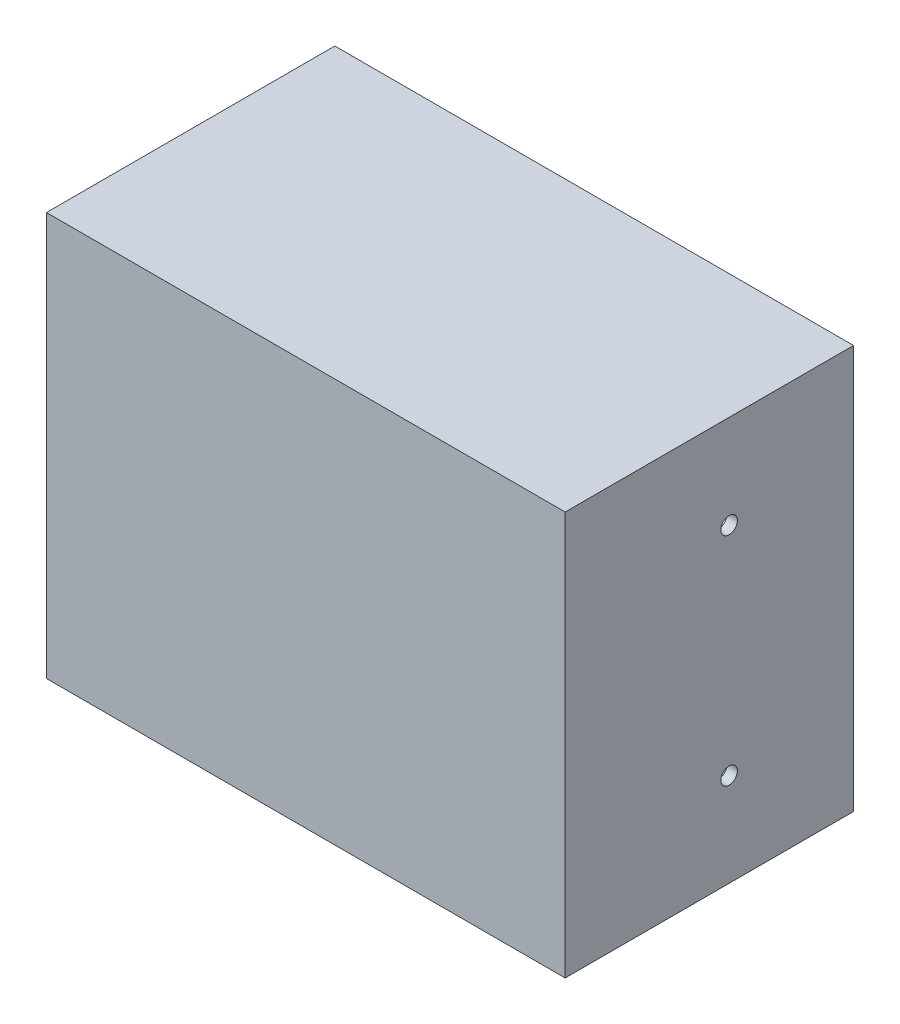
ISO-10303-21;
HEADER;
FILE_DESCRIPTION(('STEP AP214'),'2;1');
FILE_NAME('part.step','',(''),(''),'','','');
FILE_SCHEMA(('AUTOMOTIVE_DESIGN { 1 0 10303 214 1 1 1 1 }'));
ENDSEC;
DATA;
#1=APPLICATION_CONTEXT('core data for automotive mechanical design processes');
#2=APPLICATION_PROTOCOL_DEFINITION('international standard','automotive_design',2000,#1);
#3=PRODUCT_CONTEXT('',#1,'mechanical');
#4=PRODUCT('Part','Part','',(#3));
#5=PRODUCT_RELATED_PRODUCT_CATEGORY('part','',(#4));
#6=PRODUCT_DEFINITION_FORMATION('','',#4);
#7=PRODUCT_DEFINITION_CONTEXT('part definition',#1,'design');
#8=PRODUCT_DEFINITION('design','',#6,#7);
#9=PRODUCT_DEFINITION_SHAPE('','',#8);
#10=(LENGTH_UNIT() NAMED_UNIT(*) SI_UNIT(.MILLI.,.METRE.));
#11=(NAMED_UNIT(*) PLANE_ANGLE_UNIT() SI_UNIT($,.RADIAN.));
#12=(NAMED_UNIT(*) SI_UNIT($,.STERADIAN.) SOLID_ANGLE_UNIT());
#13=UNCERTAINTY_MEASURE_WITH_UNIT(LENGTH_MEASURE(1.E-05),#10,'distance_accuracy_value','');
#14=(GEOMETRIC_REPRESENTATION_CONTEXT(3) GLOBAL_UNCERTAINTY_ASSIGNED_CONTEXT((#13)) GLOBAL_UNIT_ASSIGNED_CONTEXT((#10,
#11,#12)) REPRESENTATION_CONTEXT('',''));
#15=CARTESIAN_POINT('',(0.,0.,0.));
#16=DIRECTION('',(0.,0.,1.));
#17=DIRECTION('',(1.,0.,0.));
#18=AXIS2_PLACEMENT_3D('',#15,#16,#17);
#19=CARTESIAN_POINT('',(-125.,-97.25,139.));
#20=DIRECTION('',(-1.,0.,0.));
#21=DIRECTION('',(0.,0.,1.));
#22=AXIS2_PLACEMENT_3D('',#19,#20,#21);
#23=PLANE('',#22);
#24=CARTESIAN_POINT('',(-125.,52.25,60.));
#25=DIRECTION('',(-1.,0.,0.));
#26=DIRECTION('',(0.,0.,1.));
#27=AXIS2_PLACEMENT_3D('',#24,#25,#26);
#28=CIRCLE('',#27,3.99999999999999);
#29=CARTESIAN_POINT('',(-125.,52.25,64.));
#30=VERTEX_POINT('',#29);
#31=EDGE_CURVE('E186',#30,#30,#28,.T.);
#32=ORIENTED_EDGE('',*,*,#31,.F.);
#33=EDGE_LOOP('',(#32));
#34=FACE_BOUND('',#33,.T.);
#35=CARTESIAN_POINT('',(-125.,-52.25,60.));
#36=DIRECTION('',(-1.,0.,0.));
#37=DIRECTION('',(0.,0.,1.));
#38=AXIS2_PLACEMENT_3D('',#35,#36,#37);
#39=CIRCLE('',#38,3.99999999999999);
#40=CARTESIAN_POINT('',(-125.,-52.25,64.));
#41=VERTEX_POINT('',#40);
#42=EDGE_CURVE('E174',#41,#41,#39,.T.);
#43=ORIENTED_EDGE('',*,*,#42,.F.);
#44=EDGE_LOOP('',(#43));
#45=FACE_BOUND('',#44,.T.);
#46=DIRECTION('',(0.,1.,0.));
#47=VECTOR('',#46,1.);
#48=CARTESIAN_POINT('',(-125.,-97.25,0.));
#49=LINE('',#48,#47);
#50=CARTESIAN_POINT('',(-125.,-97.25,0.));
#51=VERTEX_POINT('',#50);
#52=CARTESIAN_POINT('',(-125.,97.25,0.));
#53=VERTEX_POINT('',#52);
#54=EDGE_CURVE('E141',#51,#53,#49,.T.);
#55=ORIENTED_EDGE('',*,*,#54,.F.);
#56=DIRECTION('',(0.,0.,-1.));
#57=VECTOR('',#56,1.);
#58=CARTESIAN_POINT('',(-125.,-97.25,139.));
#59=LINE('',#58,#57);
#60=CARTESIAN_POINT('',(-125.,-97.25,139.));
#61=VERTEX_POINT('',#60);
#62=EDGE_CURVE('E11',#61,#51,#59,.T.);
#63=ORIENTED_EDGE('',*,*,#62,.F.);
#64=DIRECTION('',(0.,1.,0.));
#65=VECTOR('',#64,1.);
#66=CARTESIAN_POINT('',(-125.,-97.25,139.));
#67=LINE('',#66,#65);
#68=CARTESIAN_POINT('',(-125.,97.25,139.));
#69=VERTEX_POINT('',#68);
#70=EDGE_CURVE('E145',#61,#69,#67,.T.);
#71=ORIENTED_EDGE('',*,*,#70,.T.);
#72=DIRECTION('',(0.,0.,-1.));
#73=VECTOR('',#72,1.);
#74=CARTESIAN_POINT('',(-125.,97.25,139.));
#75=LINE('',#74,#73);
#76=EDGE_CURVE('E80',#69,#53,#75,.T.);
#77=ORIENTED_EDGE('',*,*,#76,.T.);
#78=EDGE_LOOP('',(#55,#63,#71,#77));
#79=FACE_BOUND('',#78,.T.);
#80=ADVANCED_FACE('F32',(#34,#45,#79),#23,.T.);
#81=CARTESIAN_POINT('',(-125.,-97.25,139.));
#82=DIRECTION('',(0.,1.,0.));
#83=DIRECTION('',(0.,0.,1.));
#84=AXIS2_PLACEMENT_3D('',#81,#82,#83);
#85=PLANE('',#84);
#86=DIRECTION('',(1.,0.,0.));
#87=VECTOR('',#86,1.);
#88=CARTESIAN_POINT('',(-125.,-97.25,0.));
#89=LINE('',#88,#87);
#90=CARTESIAN_POINT('',(125.,-97.25,0.));
#91=VERTEX_POINT('',#90);
#92=EDGE_CURVE('E148',#51,#91,#89,.T.);
#93=ORIENTED_EDGE('',*,*,#92,.T.);
#94=DIRECTION('',(0.,0.,-1.));
#95=VECTOR('',#94,1.);
#96=CARTESIAN_POINT('',(125.,-97.25,139.));
#97=LINE('',#96,#95);
#98=CARTESIAN_POINT('',(125.,-97.25,139.));
#99=VERTEX_POINT('',#98);
#100=EDGE_CURVE('E40',#99,#91,#97,.T.);
#101=ORIENTED_EDGE('',*,*,#100,.F.);
#102=DIRECTION('',(1.,0.,0.));
#103=VECTOR('',#102,1.);
#104=CARTESIAN_POINT('',(-125.,-97.25,139.));
#105=LINE('',#104,#103);
#106=EDGE_CURVE('E152',#61,#99,#105,.T.);
#107=ORIENTED_EDGE('',*,*,#106,.F.);
#108=ORIENTED_EDGE('',*,*,#62,.T.);
#109=EDGE_LOOP('',(#93,#101,#107,#108));
#110=FACE_BOUND('',#109,.T.);
#111=ADVANCED_FACE('F194',(#110),#85,.F.);
#112=CARTESIAN_POINT('',(125.,-97.25,139.));
#113=DIRECTION('',(-1.,0.,0.));
#114=DIRECTION('',(0.,0.,1.));
#115=AXIS2_PLACEMENT_3D('',#112,#113,#114);
#116=PLANE('',#115);
#117=CARTESIAN_POINT('',(125.,52.25,60.));
#118=DIRECTION('',(-1.,0.,0.));
#119=DIRECTION('',(0.,0.,1.));
#120=AXIS2_PLACEMENT_3D('',#117,#118,#119);
#121=CIRCLE('',#120,3.99999999999997);
#122=CARTESIAN_POINT('',(125.,52.25,64.));
#123=VERTEX_POINT('',#122);
#124=EDGE_CURVE('E183',#123,#123,#121,.T.);
#125=ORIENTED_EDGE('',*,*,#124,.T.);
#126=EDGE_LOOP('',(#125));
#127=FACE_BOUND('',#126,.T.);
#128=CARTESIAN_POINT('',(125.,-52.25,60.));
#129=DIRECTION('',(-1.,0.,0.));
#130=DIRECTION('',(0.,0.,1.));
#131=AXIS2_PLACEMENT_3D('',#128,#129,#130);
#132=CIRCLE('',#131,3.99999999999997);
#133=CARTESIAN_POINT('',(125.,-52.25,64.));
#134=VERTEX_POINT('',#133);
#135=EDGE_CURVE('E169',#134,#134,#132,.T.);
#136=ORIENTED_EDGE('',*,*,#135,.T.);
#137=EDGE_LOOP('',(#136));
#138=FACE_BOUND('',#137,.T.);
#139=DIRECTION('',(0.,1.,0.));
#140=VECTOR('',#139,1.);
#141=CARTESIAN_POINT('',(125.,-97.25,0.));
#142=LINE('',#141,#140);
#143=CARTESIAN_POINT('',(125.,97.25,0.));
#144=VERTEX_POINT('',#143);
#145=EDGE_CURVE('E159',#91,#144,#142,.T.);
#146=ORIENTED_EDGE('',*,*,#145,.T.);
#147=DIRECTION('',(0.,0.,-1.));
#148=VECTOR('',#147,1.);
#149=CARTESIAN_POINT('',(125.,97.25,139.));
#150=LINE('',#149,#148);
#151=CARTESIAN_POINT('',(125.,97.25,139.));
#152=VERTEX_POINT('',#151);
#153=EDGE_CURVE('E165',#152,#144,#150,.T.);
#154=ORIENTED_EDGE('',*,*,#153,.F.);
#155=DIRECTION('',(0.,1.,0.));
#156=VECTOR('',#155,1.);
#157=CARTESIAN_POINT('',(125.,-97.25,139.));
#158=LINE('',#157,#156);
#159=EDGE_CURVE('E150',#99,#152,#158,.T.);
#160=ORIENTED_EDGE('',*,*,#159,.F.);
#161=ORIENTED_EDGE('',*,*,#100,.T.);
#162=EDGE_LOOP('',(#146,#154,#160,#161));
#163=FACE_BOUND('',#162,.T.);
#164=ADVANCED_FACE('F202',(#127,#138,#163),#116,.F.);
#165=CARTESIAN_POINT('',(-125.,97.25,139.));
#166=DIRECTION('',(0.,1.,0.));
#167=DIRECTION('',(0.,0.,1.));
#168=AXIS2_PLACEMENT_3D('',#165,#166,#167);
#169=PLANE('',#168);
#170=DIRECTION('',(1.,0.,0.));
#171=VECTOR('',#170,1.);
#172=CARTESIAN_POINT('',(-125.,97.25,0.));
#173=LINE('',#172,#171);
#174=EDGE_CURVE('E156',#53,#144,#173,.T.);
#175=ORIENTED_EDGE('',*,*,#174,.F.);
#176=ORIENTED_EDGE('',*,*,#76,.F.);
#177=DIRECTION('',(1.,0.,0.));
#178=VECTOR('',#177,1.);
#179=CARTESIAN_POINT('',(-125.,97.25,139.));
#180=LINE('',#179,#178);
#181=EDGE_CURVE('E147',#69,#152,#180,.T.);
#182=ORIENTED_EDGE('',*,*,#181,.T.);
#183=ORIENTED_EDGE('',*,*,#153,.T.);
#184=EDGE_LOOP('',(#175,#176,#182,#183));
#185=FACE_BOUND('',#184,.T.);
#186=ADVANCED_FACE('F207',(#185),#169,.T.);
#187=CARTESIAN_POINT('',(0.,0.,139.));
#188=DIRECTION('',(0.,0.,-1.));
#189=DIRECTION('',(-1.,0.,0.));
#190=AXIS2_PLACEMENT_3D('',#187,#188,#189);
#191=PLANE('',#190);
#192=ORIENTED_EDGE('',*,*,#70,.F.);
#193=ORIENTED_EDGE('',*,*,#106,.T.);
#194=ORIENTED_EDGE('',*,*,#159,.T.);
#195=ORIENTED_EDGE('',*,*,#181,.F.);
#196=EDGE_LOOP('',(#192,#193,#194,#195));
#197=FACE_BOUND('',#196,.T.);
#198=ADVANCED_FACE('F206',(#197),#191,.F.);
#199=CARTESIAN_POINT('',(0.,0.,0.));
#200=DIRECTION('',(0.,0.,-1.));
#201=DIRECTION('',(-1.,0.,0.));
#202=AXIS2_PLACEMENT_3D('',#199,#200,#201);
#203=PLANE('',#202);
#204=DIRECTION('',(0.,-1.,0.));
#205=VECTOR('',#204,1.);
#206=CARTESIAN_POINT('',(120.,92.25,0.));
#207=LINE('',#206,#205);
#208=CARTESIAN_POINT('',(120.,92.25,0.));
#209=VERTEX_POINT('',#208);
#210=CARTESIAN_POINT('',(120.,-92.25,0.));
#211=VERTEX_POINT('',#210);
#212=EDGE_CURVE('E48',#209,#211,#207,.T.);
#213=ORIENTED_EDGE('',*,*,#212,.F.);
#214=DIRECTION('',(-1.,0.,0.));
#215=VECTOR('',#214,1.);
#216=CARTESIAN_POINT('',(120.,92.25,0.));
#217=LINE('',#216,#215);
#218=CARTESIAN_POINT('',(-120.,92.25,0.));
#219=VERTEX_POINT('',#218);
#220=EDGE_CURVE('E123',#209,#219,#217,.T.);
#221=ORIENTED_EDGE('',*,*,#220,.T.);
#222=DIRECTION('',(0.,-1.,0.));
#223=VECTOR('',#222,1.);
#224=CARTESIAN_POINT('',(-120.,92.25,0.));
#225=LINE('',#224,#223);
#226=CARTESIAN_POINT('',(-120.,-92.25,0.));
#227=VERTEX_POINT('',#226);
#228=EDGE_CURVE('E126',#219,#227,#225,.T.);
#229=ORIENTED_EDGE('',*,*,#228,.T.);
#230=DIRECTION('',(-1.,0.,0.));
#231=VECTOR('',#230,1.);
#232=CARTESIAN_POINT('',(120.,-92.25,0.));
#233=LINE('',#232,#231);
#234=EDGE_CURVE('E135',#211,#227,#233,.T.);
#235=ORIENTED_EDGE('',*,*,#234,.F.);
#236=EDGE_LOOP('',(#213,#221,#229,#235));
#237=FACE_BOUND('',#236,.T.);
#238=ORIENTED_EDGE('',*,*,#54,.T.);
#239=ORIENTED_EDGE('',*,*,#174,.T.);
#240=ORIENTED_EDGE('',*,*,#145,.F.);
#241=ORIENTED_EDGE('',*,*,#92,.F.);
#242=EDGE_LOOP('',(#238,#239,#240,#241));
#243=FACE_BOUND('',#242,.T.);
#244=ADVANCED_FACE('F197',(#237,#243),#203,.T.);
#245=CARTESIAN_POINT('',(120.,92.25,134.));
#246=DIRECTION('',(1.,0.,0.));
#247=DIRECTION('',(0.,1.,0.));
#248=AXIS2_PLACEMENT_3D('',#245,#246,#247);
#249=PLANE('',#248);
#250=CARTESIAN_POINT('',(120.,52.25,60.));
#251=DIRECTION('',(1.,0.,0.));
#252=DIRECTION('',(0.,1.,0.));
#253=AXIS2_PLACEMENT_3D('',#250,#251,#252);
#254=CIRCLE('',#253,3.99999999999998);
#255=CARTESIAN_POINT('',(120.,56.25,60.));
#256=VERTEX_POINT('',#255);
#257=EDGE_CURVE('E178',#256,#256,#254,.T.);
#258=ORIENTED_EDGE('',*,*,#257,.T.);
#259=EDGE_LOOP('',(#258));
#260=FACE_BOUND('',#259,.T.);
#261=CARTESIAN_POINT('',(120.,-52.25,60.));
#262=DIRECTION('',(1.,0.,0.));
#263=DIRECTION('',(0.,1.,0.));
#264=AXIS2_PLACEMENT_3D('',#261,#262,#263);
#265=CIRCLE('',#264,3.99999999999998);
#266=CARTESIAN_POINT('',(120.,-48.25,60.));
#267=VERTEX_POINT('',#266);
#268=EDGE_CURVE('E129',#267,#267,#265,.T.);
#269=ORIENTED_EDGE('',*,*,#268,.T.);
#270=EDGE_LOOP('',(#269));
#271=FACE_BOUND('',#270,.T.);
#272=ORIENTED_EDGE('',*,*,#212,.T.);
#273=DIRECTION('',(0.,0.,-1.));
#274=VECTOR('',#273,1.);
#275=CARTESIAN_POINT('',(120.,-92.25,134.));
#276=LINE('',#275,#274);
#277=CARTESIAN_POINT('',(120.,-92.25,134.));
#278=VERTEX_POINT('',#277);
#279=EDGE_CURVE('E102',#278,#211,#276,.T.);
#280=ORIENTED_EDGE('',*,*,#279,.F.);
#281=DIRECTION('',(0.,-1.,0.));
#282=VECTOR('',#281,1.);
#283=CARTESIAN_POINT('',(120.,92.25,134.));
#284=LINE('',#283,#282);
#285=CARTESIAN_POINT('',(120.,92.25,134.));
#286=VERTEX_POINT('',#285);
#287=EDGE_CURVE('E106',#286,#278,#284,.T.);
#288=ORIENTED_EDGE('',*,*,#287,.F.);
#289=DIRECTION('',(0.,0.,-1.));
#290=VECTOR('',#289,1.);
#291=CARTESIAN_POINT('',(120.,92.25,134.));
#292=LINE('',#291,#290);
#293=EDGE_CURVE('E139',#286,#209,#292,.T.);
#294=ORIENTED_EDGE('',*,*,#293,.T.);
#295=EDGE_LOOP('',(#272,#280,#288,#294));
#296=FACE_BOUND('',#295,.T.);
#297=ADVANCED_FACE('F104',(#260,#271,#296),#249,.F.);
#298=CARTESIAN_POINT('',(120.,92.25,134.));
#299=DIRECTION('',(0.,-1.,0.));
#300=DIRECTION('',(0.,0.,-1.));
#301=AXIS2_PLACEMENT_3D('',#298,#299,#300);
#302=PLANE('',#301);
#303=ORIENTED_EDGE('',*,*,#220,.F.);
#304=ORIENTED_EDGE('',*,*,#293,.F.);
#305=DIRECTION('',(-1.,0.,0.));
#306=VECTOR('',#305,1.);
#307=CARTESIAN_POINT('',(120.,92.25,134.));
#308=LINE('',#307,#306);
#309=CARTESIAN_POINT('',(-120.,92.25,134.));
#310=VERTEX_POINT('',#309);
#311=EDGE_CURVE('E111',#286,#310,#308,.T.);
#312=ORIENTED_EDGE('',*,*,#311,.T.);
#313=DIRECTION('',(0.,0.,-1.));
#314=VECTOR('',#313,1.);
#315=CARTESIAN_POINT('',(-120.,92.25,134.));
#316=LINE('',#315,#314);
#317=EDGE_CURVE('E142',#310,#219,#316,.T.);
#318=ORIENTED_EDGE('',*,*,#317,.T.);
#319=EDGE_LOOP('',(#303,#304,#312,#318));
#320=FACE_BOUND('',#319,.T.);
#321=ADVANCED_FACE('F224',(#320),#302,.T.);
#322=CARTESIAN_POINT('',(-120.,92.25,134.));
#323=DIRECTION('',(1.,0.,0.));
#324=DIRECTION('',(0.,1.,0.));
#325=AXIS2_PLACEMENT_3D('',#322,#323,#324);
#326=PLANE('',#325);
#327=CARTESIAN_POINT('',(-120.,52.25,60.));
#328=DIRECTION('',(1.,0.,0.));
#329=DIRECTION('',(0.,1.,0.));
#330=AXIS2_PLACEMENT_3D('',#327,#328,#329);
#331=CIRCLE('',#330,3.99999999999998);
#332=CARTESIAN_POINT('',(-120.,56.25,60.));
#333=VERTEX_POINT('',#332);
#334=EDGE_CURVE('E35',#333,#333,#331,.T.);
#335=ORIENTED_EDGE('',*,*,#334,.F.);
#336=EDGE_LOOP('',(#335));
#337=FACE_BOUND('',#336,.T.);
#338=CARTESIAN_POINT('',(-120.,-52.25,60.));
#339=DIRECTION('',(1.,0.,0.));
#340=DIRECTION('',(0.,1.,0.));
#341=AXIS2_PLACEMENT_3D('',#338,#339,#340);
#342=CIRCLE('',#341,3.99999999999998);
#343=CARTESIAN_POINT('',(-120.,-48.25,60.));
#344=VERTEX_POINT('',#343);
#345=EDGE_CURVE('E167',#344,#344,#342,.T.);
#346=ORIENTED_EDGE('',*,*,#345,.F.);
#347=EDGE_LOOP('',(#346));
#348=FACE_BOUND('',#347,.T.);
#349=ORIENTED_EDGE('',*,*,#228,.F.);
#350=ORIENTED_EDGE('',*,*,#317,.F.);
#351=DIRECTION('',(0.,-1.,0.));
#352=VECTOR('',#351,1.);
#353=CARTESIAN_POINT('',(-120.,92.25,134.));
#354=LINE('',#353,#352);
#355=CARTESIAN_POINT('',(-120.,-92.25,134.));
#356=VERTEX_POINT('',#355);
#357=EDGE_CURVE('E119',#310,#356,#354,.T.);
#358=ORIENTED_EDGE('',*,*,#357,.T.);
#359=DIRECTION('',(0.,0.,-1.));
#360=VECTOR('',#359,1.);
#361=CARTESIAN_POINT('',(-120.,-92.25,134.));
#362=LINE('',#361,#360);
#363=EDGE_CURVE('E110',#356,#227,#362,.T.);
#364=ORIENTED_EDGE('',*,*,#363,.T.);
#365=EDGE_LOOP('',(#349,#350,#358,#364));
#366=FACE_BOUND('',#365,.T.);
#367=ADVANCED_FACE('F228',(#337,#348,#366),#326,.T.);
#368=CARTESIAN_POINT('',(120.,-92.25,134.));
#369=DIRECTION('',(0.,-1.,0.));
#370=DIRECTION('',(1.,0.,0.));
#371=AXIS2_PLACEMENT_3D('',#368,#369,#370);
#372=PLANE('',#371);
#373=ORIENTED_EDGE('',*,*,#234,.T.);
#374=ORIENTED_EDGE('',*,*,#363,.F.);
#375=DIRECTION('',(-1.,0.,0.));
#376=VECTOR('',#375,1.);
#377=CARTESIAN_POINT('',(120.,-92.25,134.));
#378=LINE('',#377,#376);
#379=EDGE_CURVE('E115',#278,#356,#378,.T.);
#380=ORIENTED_EDGE('',*,*,#379,.F.);
#381=ORIENTED_EDGE('',*,*,#279,.T.);
#382=EDGE_LOOP('',(#373,#374,#380,#381));
#383=FACE_BOUND('',#382,.T.);
#384=ADVANCED_FACE('F116',(#383),#372,.F.);
#385=CARTESIAN_POINT('',(0.,0.,134.));
#386=DIRECTION('',(0.,0.,-1.));
#387=DIRECTION('',(-1.,0.,0.));
#388=AXIS2_PLACEMENT_3D('',#385,#386,#387);
#389=PLANE('',#388);
#390=ORIENTED_EDGE('',*,*,#287,.T.);
#391=ORIENTED_EDGE('',*,*,#379,.T.);
#392=ORIENTED_EDGE('',*,*,#357,.F.);
#393=ORIENTED_EDGE('',*,*,#311,.F.);
#394=EDGE_LOOP('',(#390,#391,#392,#393));
#395=FACE_BOUND('',#394,.T.);
#396=ADVANCED_FACE('F122',(#395),#389,.T.);
#397=CARTESIAN_POINT('',(-125.,-52.25,60.));
#398=DIRECTION('',(-1.,0.,0.));
#399=DIRECTION('',(0.,0.,1.));
#400=AXIS2_PLACEMENT_3D('',#397,#398,#399);
#401=CYLINDRICAL_SURFACE('',#400,3.99999999999998);
#402=ORIENTED_EDGE('',*,*,#345,.T.);
#403=EDGE_LOOP('',(#402));
#404=FACE_BOUND('',#403,.T.);
#405=ORIENTED_EDGE('',*,*,#42,.T.);
#406=EDGE_LOOP('',(#405));
#407=FACE_BOUND('',#406,.T.);
#408=ADVANCED_FACE('F237',(#404,#407),#401,.F.);
#409=ORIENTED_EDGE('',*,*,#135,.F.);
#410=EDGE_LOOP('',(#409));
#411=FACE_BOUND('',#410,.T.);
#412=ORIENTED_EDGE('',*,*,#268,.F.);
#413=EDGE_LOOP('',(#412));
#414=FACE_BOUND('',#413,.T.);
#415=ADVANCED_FACE('F240',(#411,#414),#401,.F.);
#416=CARTESIAN_POINT('',(-125.,52.25,60.));
#417=DIRECTION('',(-1.,0.,0.));
#418=DIRECTION('',(0.,0.,1.));
#419=AXIS2_PLACEMENT_3D('',#416,#417,#418);
#420=CYLINDRICAL_SURFACE('',#419,3.99999999999998);
#421=ORIENTED_EDGE('',*,*,#334,.T.);
#422=EDGE_LOOP('',(#421));
#423=FACE_BOUND('',#422,.T.);
#424=ORIENTED_EDGE('',*,*,#31,.T.);
#425=EDGE_LOOP('',(#424));
#426=FACE_BOUND('',#425,.T.);
#427=ADVANCED_FACE('F190',(#423,#426),#420,.F.);
#428=ORIENTED_EDGE('',*,*,#124,.F.);
#429=EDGE_LOOP('',(#428));
#430=FACE_BOUND('',#429,.T.);
#431=ORIENTED_EDGE('',*,*,#257,.F.);
#432=EDGE_LOOP('',(#431));
#433=FACE_BOUND('',#432,.T.);
#434=ADVANCED_FACE('F242',(#430,#433),#420,.F.);
#435=CLOSED_SHELL('',(#80,#111,#164,#186,#198,#244,#297,#321,#367,#384,#396,#408,#415,#427,#434));
#436=MANIFOLD_SOLID_BREP('B2',#435);
#437=ADVANCED_BREP_SHAPE_REPRESENTATION('',(#18,#436),#14);
#438=SHAPE_DEFINITION_REPRESENTATION(#9,#437);
ENDSEC;
END-ISO-10303-21;
